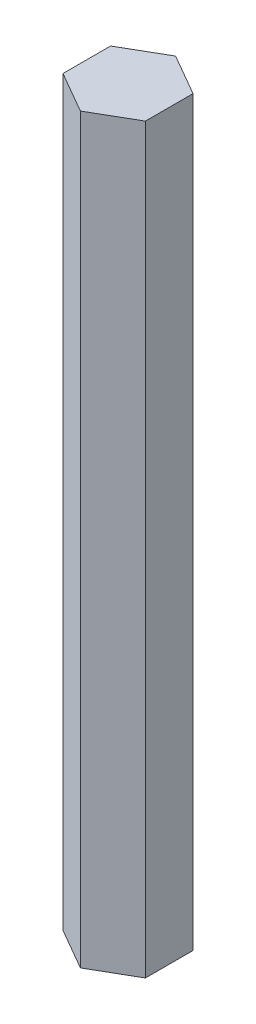
ISO-10303-21;
HEADER;
FILE_DESCRIPTION(('STEP AP214'),'2;1');
FILE_NAME('part.step','',(''),(''),'','','');
FILE_SCHEMA(('AUTOMOTIVE_DESIGN { 1 0 10303 214 1 1 1 1 }'));
ENDSEC;
DATA;
#1=APPLICATION_CONTEXT('core data for automotive mechanical design processes');
#2=APPLICATION_PROTOCOL_DEFINITION('international standard','automotive_design',2000,#1);
#3=PRODUCT_CONTEXT('',#1,'mechanical');
#4=PRODUCT('Part','Part','',(#3));
#5=PRODUCT_RELATED_PRODUCT_CATEGORY('part','',(#4));
#6=PRODUCT_DEFINITION_FORMATION('','',#4);
#7=PRODUCT_DEFINITION_CONTEXT('part definition',#1,'design');
#8=PRODUCT_DEFINITION('design','',#6,#7);
#9=PRODUCT_DEFINITION_SHAPE('','',#8);
#10=(LENGTH_UNIT() NAMED_UNIT(*) SI_UNIT(.MILLI.,.METRE.));
#11=(NAMED_UNIT(*) PLANE_ANGLE_UNIT() SI_UNIT($,.RADIAN.));
#12=(NAMED_UNIT(*) SI_UNIT($,.STERADIAN.) SOLID_ANGLE_UNIT());
#13=UNCERTAINTY_MEASURE_WITH_UNIT(LENGTH_MEASURE(1.E-05),#10,'distance_accuracy_value','');
#14=(GEOMETRIC_REPRESENTATION_CONTEXT(3) GLOBAL_UNCERTAINTY_ASSIGNED_CONTEXT((#13)) GLOBAL_UNIT_ASSIGNED_CONTEXT((#10,
#11,#12)) REPRESENTATION_CONTEXT('',''));
#15=CARTESIAN_POINT('',(0.,0.,0.));
#16=DIRECTION('',(0.,0.,1.));
#17=DIRECTION('',(1.,0.,0.));
#18=AXIS2_PLACEMENT_3D('',#15,#16,#17);
#19=CARTESIAN_POINT('',(-3.00000000000003,54.,1.73205080756889));
#20=DIRECTION('',(0.500000000000001,0.,-0.866025403784438));
#21=DIRECTION('',(-0.866025403784438,0.,-0.500000000000001));
#22=AXIS2_PLACEMENT_3D('',#19,#20,#21);
#23=PLANE('',#22);
#24=DIRECTION('',(0.866025403784438,0.,0.500000000000001));
#25=VECTOR('',#24,1.);
#26=CARTESIAN_POINT('',(-3.00000000000003,0.,1.73205080756889));
#27=LINE('',#26,#25);
#28=CARTESIAN_POINT('',(-3.00000000000003,0.,1.73205080756889));
#29=VERTEX_POINT('',#28);
#30=CARTESIAN_POINT('',(0.,0.,3.46410161513779));
#31=VERTEX_POINT('',#30);
#32=EDGE_CURVE('E132',#29,#31,#27,.T.);
#33=ORIENTED_EDGE('',*,*,#32,.T.);
#34=DIRECTION('',(0.,-1.,0.));
#35=VECTOR('',#34,1.);
#36=CARTESIAN_POINT('',(0.,54.,3.46410161513779));
#37=LINE('',#36,#35);
#38=CARTESIAN_POINT('',(0.,54.,3.46410161513779));
#39=VERTEX_POINT('',#38);
#40=EDGE_CURVE('E11',#39,#31,#37,.T.);
#41=ORIENTED_EDGE('',*,*,#40,.F.);
#42=DIRECTION('',(0.866025403784438,0.,0.500000000000001));
#43=VECTOR('',#42,1.);
#44=CARTESIAN_POINT('',(-3.00000000000003,54.,1.73205080756889));
#45=LINE('',#44,#43);
#46=CARTESIAN_POINT('',(-3.00000000000003,54.,1.73205080756889));
#47=VERTEX_POINT('',#46);
#48=EDGE_CURVE('E148',#47,#39,#45,.T.);
#49=ORIENTED_EDGE('',*,*,#48,.F.);
#50=DIRECTION('',(0.,-1.,0.));
#51=VECTOR('',#50,1.);
#52=CARTESIAN_POINT('',(-3.00000000000003,54.,1.73205080756889));
#53=LINE('',#52,#51);
#54=EDGE_CURVE('E128',#47,#29,#53,.T.);
#55=ORIENTED_EDGE('',*,*,#54,.T.);
#56=EDGE_LOOP('',(#33,#41,#49,#55));
#57=FACE_BOUND('',#56,.T.);
#58=ADVANCED_FACE('F43',(#57),#23,.F.);
#59=CARTESIAN_POINT('',(0.,54.,3.46410161513779));
#60=DIRECTION('',(-0.5,0.,-0.866025403784438));
#61=DIRECTION('',(-0.866025403784438,0.,0.5));
#62=AXIS2_PLACEMENT_3D('',#59,#60,#61);
#63=PLANE('',#62);
#64=DIRECTION('',(0.866025403784438,0.,-0.5));
#65=VECTOR('',#64,1.);
#66=CARTESIAN_POINT('',(0.,0.,3.46410161513779));
#67=LINE('',#66,#65);
#68=CARTESIAN_POINT('',(3.00000000000002,0.,1.73205080756889));
#69=VERTEX_POINT('',#68);
#70=EDGE_CURVE('E136',#31,#69,#67,.T.);
#71=ORIENTED_EDGE('',*,*,#70,.T.);
#72=DIRECTION('',(0.,-1.,0.));
#73=VECTOR('',#72,1.);
#74=CARTESIAN_POINT('',(3.00000000000002,54.,1.73205080756889));
#75=LINE('',#74,#73);
#76=CARTESIAN_POINT('',(3.00000000000002,54.,1.73205080756889));
#77=VERTEX_POINT('',#76);
#78=EDGE_CURVE('E52',#77,#69,#75,.T.);
#79=ORIENTED_EDGE('',*,*,#78,.F.);
#80=DIRECTION('',(0.866025403784438,0.,-0.5));
#81=VECTOR('',#80,1.);
#82=CARTESIAN_POINT('',(0.,54.,3.46410161513779));
#83=LINE('',#82,#81);
#84=EDGE_CURVE('E97',#39,#77,#83,.T.);
#85=ORIENTED_EDGE('',*,*,#84,.F.);
#86=ORIENTED_EDGE('',*,*,#40,.T.);
#87=EDGE_LOOP('',(#71,#79,#85,#86));
#88=FACE_BOUND('',#87,.T.);
#89=ADVANCED_FACE('F176',(#88),#63,.F.);
#90=CARTESIAN_POINT('',(3.00000000000002,54.,1.73205080756889));
#91=DIRECTION('',(-1.,0.,0.));
#92=DIRECTION('',(0.,0.,1.));
#93=AXIS2_PLACEMENT_3D('',#90,#91,#92);
#94=PLANE('',#93);
#95=DIRECTION('',(0.,0.,-1.));
#96=VECTOR('',#95,1.);
#97=CARTESIAN_POINT('',(3.00000000000002,0.,1.73205080756889));
#98=LINE('',#97,#96);
#99=CARTESIAN_POINT('',(3.00000000000002,0.,-1.7320508075689));
#100=VERTEX_POINT('',#99);
#101=EDGE_CURVE('E139',#69,#100,#98,.T.);
#102=ORIENTED_EDGE('',*,*,#101,.T.);
#103=DIRECTION('',(0.,-1.,0.));
#104=VECTOR('',#103,1.);
#105=CARTESIAN_POINT('',(3.00000000000002,54.,-1.7320508075689));
#106=LINE('',#105,#104);
#107=CARTESIAN_POINT('',(3.00000000000002,54.,-1.7320508075689));
#108=VERTEX_POINT('',#107);
#109=EDGE_CURVE('E121',#108,#100,#106,.T.);
#110=ORIENTED_EDGE('',*,*,#109,.F.);
#111=DIRECTION('',(0.,0.,-1.));
#112=VECTOR('',#111,1.);
#113=CARTESIAN_POINT('',(3.00000000000002,54.,1.73205080756889));
#114=LINE('',#113,#112);
#115=EDGE_CURVE('E110',#77,#108,#114,.T.);
#116=ORIENTED_EDGE('',*,*,#115,.F.);
#117=ORIENTED_EDGE('',*,*,#78,.T.);
#118=EDGE_LOOP('',(#102,#110,#116,#117));
#119=FACE_BOUND('',#118,.T.);
#120=ADVANCED_FACE('F158',(#119),#94,.F.);
#121=CARTESIAN_POINT('',(3.00000000000002,54.,-1.7320508075689));
#122=DIRECTION('',(-0.5,0.,0.866025403784439));
#123=DIRECTION('',(0.866025403784439,0.,0.5));
#124=AXIS2_PLACEMENT_3D('',#121,#122,#123);
#125=PLANE('',#124);
#126=DIRECTION('',(-0.866025403784439,0.,-0.5));
#127=VECTOR('',#126,1.);
#128=CARTESIAN_POINT('',(3.00000000000002,0.,-1.7320508075689));
#129=LINE('',#128,#127);
#130=CARTESIAN_POINT('',(0.,0.,-3.46410161513779));
#131=VERTEX_POINT('',#130);
#132=EDGE_CURVE('E119',#100,#131,#129,.T.);
#133=ORIENTED_EDGE('',*,*,#132,.T.);
#134=DIRECTION('',(0.,-1.,0.));
#135=VECTOR('',#134,1.);
#136=CARTESIAN_POINT('',(0.,54.,-3.46410161513779));
#137=LINE('',#136,#135);
#138=CARTESIAN_POINT('',(0.,54.,-3.46410161513779));
#139=VERTEX_POINT('',#138);
#140=EDGE_CURVE('E116',#139,#131,#137,.T.);
#141=ORIENTED_EDGE('',*,*,#140,.F.);
#142=DIRECTION('',(-0.866025403784439,0.,-0.5));
#143=VECTOR('',#142,1.);
#144=CARTESIAN_POINT('',(3.00000000000002,54.,-1.7320508075689));
#145=LINE('',#144,#143);
#146=EDGE_CURVE('E104',#108,#139,#145,.T.);
#147=ORIENTED_EDGE('',*,*,#146,.F.);
#148=ORIENTED_EDGE('',*,*,#109,.T.);
#149=EDGE_LOOP('',(#133,#141,#147,#148));
#150=FACE_BOUND('',#149,.T.);
#151=ADVANCED_FACE('F117',(#150),#125,.F.);
#152=CARTESIAN_POINT('',(0.,54.,-3.46410161513779));
#153=DIRECTION('',(0.5,0.,0.866025403784439));
#154=DIRECTION('',(0.866025403784439,0.,-0.5));
#155=AXIS2_PLACEMENT_3D('',#152,#153,#154);
#156=PLANE('',#155);
#157=DIRECTION('',(-0.866025403784439,0.,0.5));
#158=VECTOR('',#157,1.);
#159=CARTESIAN_POINT('',(0.,0.,-3.46410161513779));
#160=LINE('',#159,#158);
#161=CARTESIAN_POINT('',(-3.00000000000003,0.,-1.73205080756889));
#162=VERTEX_POINT('',#161);
#163=EDGE_CURVE('E83',#131,#162,#160,.T.);
#164=ORIENTED_EDGE('',*,*,#163,.T.);
#165=DIRECTION('',(0.,-1.,0.));
#166=VECTOR('',#165,1.);
#167=CARTESIAN_POINT('',(-3.00000000000003,54.,-1.73205080756889));
#168=LINE('',#167,#166);
#169=CARTESIAN_POINT('',(-3.00000000000003,54.,-1.73205080756889));
#170=VERTEX_POINT('',#169);
#171=EDGE_CURVE('E122',#170,#162,#168,.T.);
#172=ORIENTED_EDGE('',*,*,#171,.F.);
#173=DIRECTION('',(-0.866025403784439,0.,0.5));
#174=VECTOR('',#173,1.);
#175=CARTESIAN_POINT('',(0.,54.,-3.46410161513779));
#176=LINE('',#175,#174);
#177=EDGE_CURVE('E108',#139,#170,#176,.T.);
#178=ORIENTED_EDGE('',*,*,#177,.F.);
#179=ORIENTED_EDGE('',*,*,#140,.T.);
#180=EDGE_LOOP('',(#164,#172,#178,#179));
#181=FACE_BOUND('',#180,.T.);
#182=ADVANCED_FACE('F124',(#181),#156,.F.);
#183=CARTESIAN_POINT('',(-3.00000000000003,54.,-1.73205080756889));
#184=DIRECTION('',(1.,0.,0.));
#185=DIRECTION('',(0.,0.,-1.));
#186=AXIS2_PLACEMENT_3D('',#183,#184,#185);
#187=PLANE('',#186);
#188=DIRECTION('',(0.,0.,1.));
#189=VECTOR('',#188,1.);
#190=CARTESIAN_POINT('',(-3.00000000000003,0.,-1.73205080756889));
#191=LINE('',#190,#189);
#192=EDGE_CURVE('E89',#162,#29,#191,.T.);
#193=ORIENTED_EDGE('',*,*,#192,.T.);
#194=ORIENTED_EDGE('',*,*,#54,.F.);
#195=DIRECTION('',(0.,0.,1.));
#196=VECTOR('',#195,1.);
#197=CARTESIAN_POINT('',(-3.00000000000003,54.,-1.73205080756889));
#198=LINE('',#197,#196);
#199=EDGE_CURVE('E60',#170,#47,#198,.T.);
#200=ORIENTED_EDGE('',*,*,#199,.F.);
#201=ORIENTED_EDGE('',*,*,#171,.T.);
#202=EDGE_LOOP('',(#193,#194,#200,#201));
#203=FACE_BOUND('',#202,.T.);
#204=ADVANCED_FACE('F165',(#203),#187,.F.);
#205=CARTESIAN_POINT('',(0.,54.,0.));
#206=DIRECTION('',(0.,1.,0.));
#207=DIRECTION('',(0.,0.,1.));
#208=AXIS2_PLACEMENT_3D('',#205,#206,#207);
#209=PLANE('',#208);
#210=ORIENTED_EDGE('',*,*,#48,.T.);
#211=ORIENTED_EDGE('',*,*,#84,.T.);
#212=ORIENTED_EDGE('',*,*,#115,.T.);
#213=ORIENTED_EDGE('',*,*,#146,.T.);
#214=ORIENTED_EDGE('',*,*,#177,.T.);
#215=ORIENTED_EDGE('',*,*,#199,.T.);
#216=EDGE_LOOP('',(#210,#211,#212,#213,#214,#215));
#217=FACE_BOUND('',#216,.T.);
#218=ADVANCED_FACE('F106',(#217),#209,.T.);
#219=CARTESIAN_POINT('',(0.,0.,0.));
#220=DIRECTION('',(0.,1.,0.));
#221=DIRECTION('',(0.,0.,1.));
#222=AXIS2_PLACEMENT_3D('',#219,#220,#221);
#223=PLANE('',#222);
#224=ORIENTED_EDGE('',*,*,#32,.F.);
#225=ORIENTED_EDGE('',*,*,#192,.F.);
#226=ORIENTED_EDGE('',*,*,#163,.F.);
#227=ORIENTED_EDGE('',*,*,#132,.F.);
#228=ORIENTED_EDGE('',*,*,#101,.F.);
#229=ORIENTED_EDGE('',*,*,#70,.F.);
#230=EDGE_LOOP('',(#224,#225,#226,#227,#228,#229));
#231=FACE_BOUND('',#230,.T.);
#232=ADVANCED_FACE('F161',(#231),#223,.F.);
#233=CLOSED_SHELL('',(#58,#89,#120,#151,#182,#204,#218,#232));
#234=MANIFOLD_SOLID_BREP('B2',#233);
#235=ADVANCED_BREP_SHAPE_REPRESENTATION('',(#18,#234),#14);
#236=SHAPE_DEFINITION_REPRESENTATION(#9,#235);
ENDSEC;
END-ISO-10303-21;
